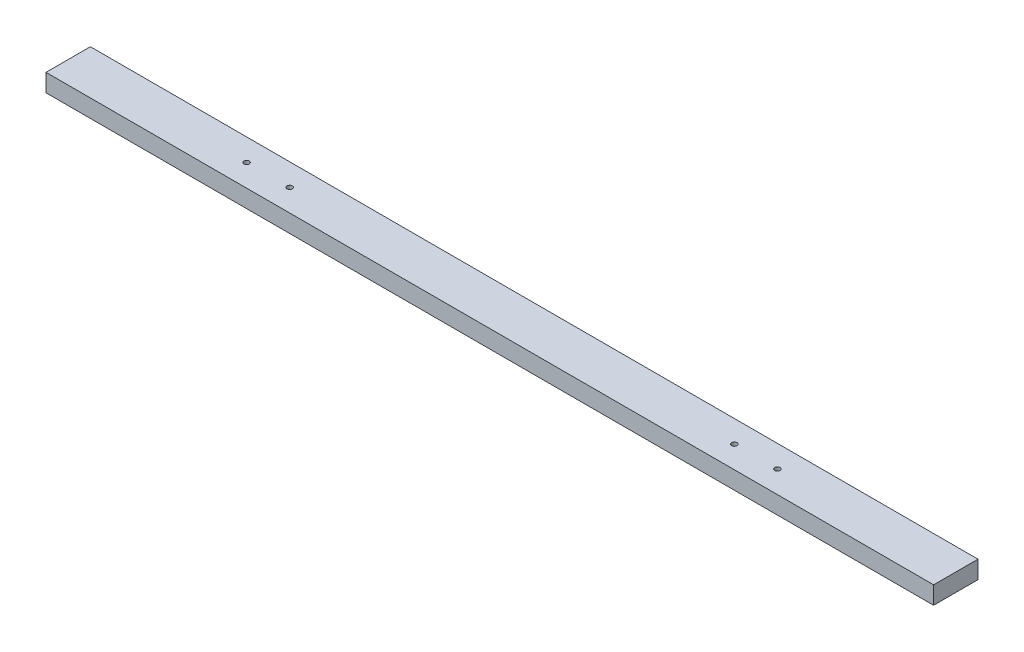
ISO-10303-21;
HEADER;
FILE_DESCRIPTION(('STEP AP214'),'2;1');
FILE_NAME('part.step','',(''),(''),'','','');
FILE_SCHEMA(('AUTOMOTIVE_DESIGN { 1 0 10303 214 1 1 1 1 }'));
ENDSEC;
DATA;
#1=APPLICATION_CONTEXT('core data for automotive mechanical design processes');
#2=APPLICATION_PROTOCOL_DEFINITION('international standard','automotive_design',2000,#1);
#3=PRODUCT_CONTEXT('',#1,'mechanical');
#4=PRODUCT('Part','Part','',(#3));
#5=PRODUCT_RELATED_PRODUCT_CATEGORY('part','',(#4));
#6=PRODUCT_DEFINITION_FORMATION('','',#4);
#7=PRODUCT_DEFINITION_CONTEXT('part definition',#1,'design');
#8=PRODUCT_DEFINITION('design','',#6,#7);
#9=PRODUCT_DEFINITION_SHAPE('','',#8);
#10=(LENGTH_UNIT() NAMED_UNIT(*) SI_UNIT(.MILLI.,.METRE.));
#11=(NAMED_UNIT(*) PLANE_ANGLE_UNIT() SI_UNIT($,.RADIAN.));
#12=(NAMED_UNIT(*) SI_UNIT($,.STERADIAN.) SOLID_ANGLE_UNIT());
#13=UNCERTAINTY_MEASURE_WITH_UNIT(LENGTH_MEASURE(1.E-05),#10,'distance_accuracy_value','');
#14=(GEOMETRIC_REPRESENTATION_CONTEXT(3) GLOBAL_UNCERTAINTY_ASSIGNED_CONTEXT((#13)) GLOBAL_UNIT_ASSIGNED_CONTEXT((#10,
#11,#12)) REPRESENTATION_CONTEXT('',''));
#15=CARTESIAN_POINT('',(0.,0.,0.));
#16=DIRECTION('',(0.,0.,1.));
#17=DIRECTION('',(1.,0.,0.));
#18=AXIS2_PLACEMENT_3D('',#15,#16,#17);
#19=CARTESIAN_POINT('',(0.,20.,0.));
#20=DIRECTION('',(0.,-1.,0.));
#21=DIRECTION('',(0.,0.,-1.));
#22=AXIS2_PLACEMENT_3D('',#19,#20,#21);
#23=PLANE('',#22);
#24=DIRECTION('',(0.,0.,1.));
#25=VECTOR('',#24,1.);
#26=CARTESIAN_POINT('',(0.,20.,0.));
#27=LINE('',#26,#25);
#28=CARTESIAN_POINT('',(0.,20.,-50.));
#29=VERTEX_POINT('',#28);
#30=CARTESIAN_POINT('',(0.,20.,0.));
#31=VERTEX_POINT('',#30);
#32=EDGE_CURVE('E93',#29,#31,#27,.T.);
#33=ORIENTED_EDGE('',*,*,#32,.T.);
#34=DIRECTION('',(1.,0.,0.));
#35=VECTOR('',#34,1.);
#36=CARTESIAN_POINT('',(0.,20.,0.));
#37=LINE('',#36,#35);
#38=CARTESIAN_POINT('',(1000.,20.,0.));
#39=VERTEX_POINT('',#38);
#40=EDGE_CURVE('E88',#31,#39,#37,.T.);
#41=ORIENTED_EDGE('',*,*,#40,.T.);
#42=DIRECTION('',(0.,0.,-1.));
#43=VECTOR('',#42,1.);
#44=CARTESIAN_POINT('',(1000.,20.,0.));
#45=LINE('',#44,#43);
#46=CARTESIAN_POINT('',(1000.,20.,-50.0000000000001));
#47=VERTEX_POINT('',#46);
#48=EDGE_CURVE('E91',#39,#47,#45,.T.);
#49=ORIENTED_EDGE('',*,*,#48,.T.);
#50=DIRECTION('',(-1.,0.,0.));
#51=VECTOR('',#50,1.);
#52=CARTESIAN_POINT('',(0.,20.,-50.));
#53=LINE('',#52,#51);
#54=EDGE_CURVE('E58',#47,#29,#53,.T.);
#55=ORIENTED_EDGE('',*,*,#54,.T.);
#56=EDGE_LOOP('',(#33,#41,#49,#55));
#57=FACE_BOUND('',#56,.T.);
#58=CARTESIAN_POINT('',(799.,20.,-25.0000000000001));
#59=DIRECTION('',(0.,1.,0.));
#60=DIRECTION('',(0.,0.,1.));
#61=AXIS2_PLACEMENT_3D('',#58,#59,#60);
#62=CIRCLE('',#61,3.00000000000005);
#63=CARTESIAN_POINT('',(799.,20.,-22.));
#64=VERTEX_POINT('',#63);
#65=EDGE_CURVE('E108',#64,#64,#62,.T.);
#66=ORIENTED_EDGE('',*,*,#65,.F.);
#67=EDGE_LOOP('',(#66));
#68=FACE_BOUND('',#67,.T.);
#69=CARTESIAN_POINT('',(750.5,20.,-25.0000000000001));
#70=DIRECTION('',(0.,1.,0.));
#71=DIRECTION('',(0.,0.,1.));
#72=AXIS2_PLACEMENT_3D('',#69,#70,#71);
#73=CIRCLE('',#72,3.00000000000005);
#74=CARTESIAN_POINT('',(750.5,20.,-22.));
#75=VERTEX_POINT('',#74);
#76=EDGE_CURVE('E123',#75,#75,#73,.T.);
#77=ORIENTED_EDGE('',*,*,#76,.F.);
#78=EDGE_LOOP('',(#77));
#79=FACE_BOUND('',#78,.T.);
#80=CARTESIAN_POINT('',(201.,20.,-25.0000000000001));
#81=DIRECTION('',(0.,1.,0.));
#82=DIRECTION('',(0.,0.,-1.));
#83=AXIS2_PLACEMENT_3D('',#80,#81,#82);
#84=CIRCLE('',#83,3.00000000000005);
#85=CARTESIAN_POINT('',(201.,20.,-28.0000000000001));
#86=VERTEX_POINT('',#85);
#87=EDGE_CURVE('E129',#86,#86,#84,.T.);
#88=ORIENTED_EDGE('',*,*,#87,.F.);
#89=EDGE_LOOP('',(#88));
#90=FACE_BOUND('',#89,.T.);
#91=CARTESIAN_POINT('',(249.5,20.,-25.0000000000001));
#92=DIRECTION('',(0.,1.,0.));
#93=DIRECTION('',(0.,0.,-1.));
#94=AXIS2_PLACEMENT_3D('',#91,#92,#93);
#95=CIRCLE('',#94,3.00000000000005);
#96=CARTESIAN_POINT('',(249.5,20.,-28.0000000000001));
#97=VERTEX_POINT('',#96);
#98=EDGE_CURVE('E135',#97,#97,#95,.T.);
#99=ORIENTED_EDGE('',*,*,#98,.F.);
#100=EDGE_LOOP('',(#99));
#101=FACE_BOUND('',#100,.T.);
#102=ADVANCED_FACE('F41',(#57,#68,#79,#90,#101),#23,.F.);
#103=CARTESIAN_POINT('',(0.,0.,0.));
#104=DIRECTION('',(0.,-1.,0.));
#105=DIRECTION('',(0.,0.,-1.));
#106=AXIS2_PLACEMENT_3D('',#103,#104,#105);
#107=PLANE('',#106);
#108=CARTESIAN_POINT('',(201.,0.,-25.0000000000001));
#109=DIRECTION('',(0.,1.,0.));
#110=DIRECTION('',(0.,0.,-1.));
#111=AXIS2_PLACEMENT_3D('',#108,#109,#110);
#112=CIRCLE('',#111,3.00000000000005);
#113=CARTESIAN_POINT('',(201.,0.,-28.0000000000001));
#114=VERTEX_POINT('',#113);
#115=EDGE_CURVE('E132',#114,#114,#112,.T.);
#116=ORIENTED_EDGE('',*,*,#115,.T.);
#117=EDGE_LOOP('',(#116));
#118=FACE_BOUND('',#117,.T.);
#119=CARTESIAN_POINT('',(799.,0.,-25.0000000000001));
#120=DIRECTION('',(0.,1.,0.));
#121=DIRECTION('',(0.,0.,1.));
#122=AXIS2_PLACEMENT_3D('',#119,#120,#121);
#123=CIRCLE('',#122,3.00000000000005);
#124=CARTESIAN_POINT('',(799.,0.,-22.));
#125=VERTEX_POINT('',#124);
#126=EDGE_CURVE('E120',#125,#125,#123,.T.);
#127=ORIENTED_EDGE('',*,*,#126,.T.);
#128=EDGE_LOOP('',(#127));
#129=FACE_BOUND('',#128,.T.);
#130=DIRECTION('',(0.,0.,1.));
#131=VECTOR('',#130,1.);
#132=CARTESIAN_POINT('',(0.,0.,0.));
#133=LINE('',#132,#131);
#134=CARTESIAN_POINT('',(0.,0.,-50.));
#135=VERTEX_POINT('',#134);
#136=CARTESIAN_POINT('',(0.,0.,0.));
#137=VERTEX_POINT('',#136);
#138=EDGE_CURVE('E105',#135,#137,#133,.T.);
#139=ORIENTED_EDGE('',*,*,#138,.F.);
#140=DIRECTION('',(-1.,0.,0.));
#141=VECTOR('',#140,1.);
#142=CARTESIAN_POINT('',(0.,0.,-50.));
#143=LINE('',#142,#141);
#144=CARTESIAN_POINT('',(1000.,0.,-50.0000000000001));
#145=VERTEX_POINT('',#144);
#146=EDGE_CURVE('E81',#145,#135,#143,.T.);
#147=ORIENTED_EDGE('',*,*,#146,.F.);
#148=DIRECTION('',(0.,0.,-1.));
#149=VECTOR('',#148,1.);
#150=CARTESIAN_POINT('',(1000.,0.,0.));
#151=LINE('',#150,#149);
#152=CARTESIAN_POINT('',(1000.,0.,0.));
#153=VERTEX_POINT('',#152);
#154=EDGE_CURVE('E75',#153,#145,#151,.T.);
#155=ORIENTED_EDGE('',*,*,#154,.F.);
#156=DIRECTION('',(1.,0.,0.));
#157=VECTOR('',#156,1.);
#158=CARTESIAN_POINT('',(0.,0.,0.));
#159=LINE('',#158,#157);
#160=EDGE_CURVE('E97',#137,#153,#159,.T.);
#161=ORIENTED_EDGE('',*,*,#160,.F.);
#162=EDGE_LOOP('',(#139,#147,#155,#161));
#163=FACE_BOUND('',#162,.T.);
#164=CARTESIAN_POINT('',(750.5,0.,-25.0000000000001));
#165=DIRECTION('',(0.,1.,0.));
#166=DIRECTION('',(0.,0.,1.));
#167=AXIS2_PLACEMENT_3D('',#164,#165,#166);
#168=CIRCLE('',#167,3.00000000000005);
#169=CARTESIAN_POINT('',(750.5,0.,-22.));
#170=VERTEX_POINT('',#169);
#171=EDGE_CURVE('E126',#170,#170,#168,.T.);
#172=ORIENTED_EDGE('',*,*,#171,.T.);
#173=EDGE_LOOP('',(#172));
#174=FACE_BOUND('',#173,.T.);
#175=CARTESIAN_POINT('',(249.5,0.,-25.0000000000001));
#176=DIRECTION('',(0.,1.,0.));
#177=DIRECTION('',(0.,0.,-1.));
#178=AXIS2_PLACEMENT_3D('',#175,#176,#177);
#179=CIRCLE('',#178,3.00000000000005);
#180=CARTESIAN_POINT('',(249.5,0.,-28.0000000000001));
#181=VERTEX_POINT('',#180);
#182=EDGE_CURVE('E138',#181,#181,#179,.T.);
#183=ORIENTED_EDGE('',*,*,#182,.T.);
#184=EDGE_LOOP('',(#183));
#185=FACE_BOUND('',#184,.T.);
#186=ADVANCED_FACE('F116',(#118,#129,#163,#174,#185),#107,.T.);
#187=CARTESIAN_POINT('',(0.,20.,0.));
#188=DIRECTION('',(1.,0.,0.));
#189=DIRECTION('',(0.,0.,-1.));
#190=AXIS2_PLACEMENT_3D('',#187,#188,#189);
#191=PLANE('',#190);
#192=ORIENTED_EDGE('',*,*,#138,.T.);
#193=DIRECTION('',(0.,-1.,0.));
#194=VECTOR('',#193,1.);
#195=CARTESIAN_POINT('',(0.,20.,0.));
#196=LINE('',#195,#194);
#197=EDGE_CURVE('E11',#31,#137,#196,.T.);
#198=ORIENTED_EDGE('',*,*,#197,.F.);
#199=ORIENTED_EDGE('',*,*,#32,.F.);
#200=DIRECTION('',(0.,-1.,0.));
#201=VECTOR('',#200,1.);
#202=CARTESIAN_POINT('',(0.,20.,-50.));
#203=LINE('',#202,#201);
#204=EDGE_CURVE('E101',#29,#135,#203,.T.);
#205=ORIENTED_EDGE('',*,*,#204,.T.);
#206=EDGE_LOOP('',(#192,#198,#199,#205));
#207=FACE_BOUND('',#206,.T.);
#208=ADVANCED_FACE('F43',(#207),#191,.F.);
#209=CARTESIAN_POINT('',(0.,20.,0.));
#210=DIRECTION('',(0.,0.,-1.));
#211=DIRECTION('',(-1.,0.,0.));
#212=AXIS2_PLACEMENT_3D('',#209,#210,#211);
#213=PLANE('',#212);
#214=ORIENTED_EDGE('',*,*,#160,.T.);
#215=DIRECTION('',(0.,-1.,0.));
#216=VECTOR('',#215,1.);
#217=CARTESIAN_POINT('',(1000.,20.,0.));
#218=LINE('',#217,#216);
#219=EDGE_CURVE('E50',#39,#153,#218,.T.);
#220=ORIENTED_EDGE('',*,*,#219,.F.);
#221=ORIENTED_EDGE('',*,*,#40,.F.);
#222=ORIENTED_EDGE('',*,*,#197,.T.);
#223=EDGE_LOOP('',(#214,#220,#221,#222));
#224=FACE_BOUND('',#223,.T.);
#225=ADVANCED_FACE('F96',(#224),#213,.F.);
#226=CARTESIAN_POINT('',(1000.,20.,0.));
#227=DIRECTION('',(-1.,0.,0.));
#228=DIRECTION('',(0.,0.,1.));
#229=AXIS2_PLACEMENT_3D('',#226,#227,#228);
#230=PLANE('',#229);
#231=ORIENTED_EDGE('',*,*,#154,.T.);
#232=DIRECTION('',(0.,-1.,0.));
#233=VECTOR('',#232,1.);
#234=CARTESIAN_POINT('',(1000.,20.,-50.0000000000001));
#235=LINE('',#234,#233);
#236=EDGE_CURVE('E98',#47,#145,#235,.T.);
#237=ORIENTED_EDGE('',*,*,#236,.F.);
#238=ORIENTED_EDGE('',*,*,#48,.F.);
#239=ORIENTED_EDGE('',*,*,#219,.T.);
#240=EDGE_LOOP('',(#231,#237,#238,#239));
#241=FACE_BOUND('',#240,.T.);
#242=ADVANCED_FACE('F99',(#241),#230,.F.);
#243=CARTESIAN_POINT('',(0.,20.,-50.));
#244=DIRECTION('',(0.,0.,1.));
#245=DIRECTION('',(1.,0.,0.));
#246=AXIS2_PLACEMENT_3D('',#243,#244,#245);
#247=PLANE('',#246);
#248=ORIENTED_EDGE('',*,*,#146,.T.);
#249=ORIENTED_EDGE('',*,*,#204,.F.);
#250=ORIENTED_EDGE('',*,*,#54,.F.);
#251=ORIENTED_EDGE('',*,*,#236,.T.);
#252=EDGE_LOOP('',(#248,#249,#250,#251));
#253=FACE_BOUND('',#252,.T.);
#254=ADVANCED_FACE('F113',(#253),#247,.F.);
#255=CARTESIAN_POINT('',(799.,20.,-25.0000000000001));
#256=DIRECTION('',(0.,-1.,0.));
#257=DIRECTION('',(0.,0.,-1.));
#258=AXIS2_PLACEMENT_3D('',#255,#256,#257);
#259=CYLINDRICAL_SURFACE('',#258,3.00000000000005);
#260=ORIENTED_EDGE('',*,*,#65,.T.);
#261=EDGE_LOOP('',(#260));
#262=FACE_BOUND('',#261,.T.);
#263=ORIENTED_EDGE('',*,*,#126,.F.);
#264=EDGE_LOOP('',(#263));
#265=FACE_BOUND('',#264,.T.);
#266=ADVANCED_FACE('F155',(#262,#265),#259,.F.);
#267=CARTESIAN_POINT('',(750.5,20.,-25.0000000000001));
#268=DIRECTION('',(0.,-1.,0.));
#269=DIRECTION('',(0.,0.,-1.));
#270=AXIS2_PLACEMENT_3D('',#267,#268,#269);
#271=CYLINDRICAL_SURFACE('',#270,3.00000000000005);
#272=ORIENTED_EDGE('',*,*,#76,.T.);
#273=EDGE_LOOP('',(#272));
#274=FACE_BOUND('',#273,.T.);
#275=ORIENTED_EDGE('',*,*,#171,.F.);
#276=EDGE_LOOP('',(#275));
#277=FACE_BOUND('',#276,.T.);
#278=ADVANCED_FACE('F200',(#274,#277),#271,.F.);
#279=CARTESIAN_POINT('',(201.,20.,-25.0000000000001));
#280=DIRECTION('',(0.,-1.,0.));
#281=DIRECTION('',(0.,0.,-1.));
#282=AXIS2_PLACEMENT_3D('',#279,#280,#281);
#283=CYLINDRICAL_SURFACE('',#282,3.00000000000005);
#284=ORIENTED_EDGE('',*,*,#87,.T.);
#285=EDGE_LOOP('',(#284));
#286=FACE_BOUND('',#285,.T.);
#287=ORIENTED_EDGE('',*,*,#115,.F.);
#288=EDGE_LOOP('',(#287));
#289=FACE_BOUND('',#288,.T.);
#290=ADVANCED_FACE('F208',(#286,#289),#283,.F.);
#291=CARTESIAN_POINT('',(249.5,20.,-25.0000000000001));
#292=DIRECTION('',(0.,-1.,0.));
#293=DIRECTION('',(0.,0.,-1.));
#294=AXIS2_PLACEMENT_3D('',#291,#292,#293);
#295=CYLINDRICAL_SURFACE('',#294,3.00000000000005);
#296=ORIENTED_EDGE('',*,*,#98,.T.);
#297=EDGE_LOOP('',(#296));
#298=FACE_BOUND('',#297,.T.);
#299=ORIENTED_EDGE('',*,*,#182,.F.);
#300=EDGE_LOOP('',(#299));
#301=FACE_BOUND('',#300,.T.);
#302=ADVANCED_FACE('F144',(#298,#301),#295,.F.);
#303=CLOSED_SHELL('',(#102,#186,#208,#225,#242,#254,#266,#278,#290,#302));
#304=MANIFOLD_SOLID_BREP('B2',#303);
#305=ADVANCED_BREP_SHAPE_REPRESENTATION('',(#18,#304),#14);
#306=SHAPE_DEFINITION_REPRESENTATION(#9,#305);
ENDSEC;
END-ISO-10303-21;
